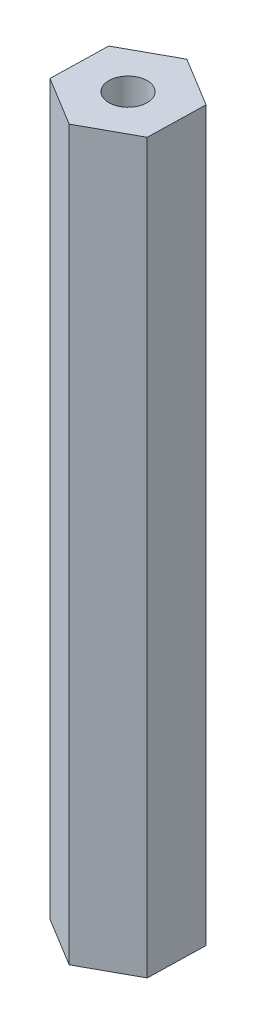
ISO-10303-21;
HEADER;
FILE_DESCRIPTION(('STEP AP214'),'2;1');
FILE_NAME('part.step','',(''),(''),'','','');
FILE_SCHEMA(('AUTOMOTIVE_DESIGN { 1 0 10303 214 1 1 1 1 }'));
ENDSEC;
DATA;
#1=APPLICATION_CONTEXT('core data for automotive mechanical design processes');
#2=APPLICATION_PROTOCOL_DEFINITION('international standard','automotive_design',2000,#1);
#3=PRODUCT_CONTEXT('',#1,'mechanical');
#4=PRODUCT('Part','Part','',(#3));
#5=PRODUCT_RELATED_PRODUCT_CATEGORY('part','',(#4));
#6=PRODUCT_DEFINITION_FORMATION('','',#4);
#7=PRODUCT_DEFINITION_CONTEXT('part definition',#1,'design');
#8=PRODUCT_DEFINITION('design','',#6,#7);
#9=PRODUCT_DEFINITION_SHAPE('','',#8);
#10=(LENGTH_UNIT() NAMED_UNIT(*) SI_UNIT(.MILLI.,.METRE.));
#11=(NAMED_UNIT(*) PLANE_ANGLE_UNIT() SI_UNIT($,.RADIAN.));
#12=(NAMED_UNIT(*) SI_UNIT($,.STERADIAN.) SOLID_ANGLE_UNIT());
#13=UNCERTAINTY_MEASURE_WITH_UNIT(LENGTH_MEASURE(1.E-05),#10,'distance_accuracy_value','');
#14=(GEOMETRIC_REPRESENTATION_CONTEXT(3) GLOBAL_UNCERTAINTY_ASSIGNED_CONTEXT((#13)) GLOBAL_UNIT_ASSIGNED_CONTEXT((#10,
#11,#12)) REPRESENTATION_CONTEXT('',''));
#15=CARTESIAN_POINT('',(0.,0.,0.));
#16=DIRECTION('',(0.,0.,1.));
#17=DIRECTION('',(1.,0.,0.));
#18=AXIS2_PLACEMENT_3D('',#15,#16,#17);
#19=CARTESIAN_POINT('',(6.41191031670347,47.5,3.90137660626155));
#20=DIRECTION('',(-0.999735132754464,0.,-0.0230144375645835));
#21=DIRECTION('',(-0.0230144375645835,0.,0.999735132754464));
#22=AXIS2_PLACEMENT_3D('',#19,#20,#21);
#23=PLANE('',#22);
#24=DIRECTION('',(0.0230144375645835,0.,-0.999735132754464));
#25=VECTOR('',#24,1.);
#26=CARTESIAN_POINT('',(6.41191031670347,-47.5,3.90137660626155));
#27=LINE('',#26,#25);
#28=CARTESIAN_POINT('',(6.41191031670347,-47.5,3.90137660626155));
#29=VERTEX_POINT('',#28);
#30=CARTESIAN_POINT('',(6.58464640910456,-47.5,-3.60218891792196));
#31=VERTEX_POINT('',#30);
#32=EDGE_CURVE('E124',#29,#31,#27,.T.);
#33=ORIENTED_EDGE('',*,*,#32,.T.);
#34=DIRECTION('',(0.,-1.,0.));
#35=VECTOR('',#34,1.);
#36=CARTESIAN_POINT('',(6.58464640910456,47.5,-3.60218891792196));
#37=LINE('',#36,#35);
#38=CARTESIAN_POINT('',(6.58464640910456,47.5,-3.60218891792196));
#39=VERTEX_POINT('',#38);
#40=EDGE_CURVE('E11',#39,#31,#37,.T.);
#41=ORIENTED_EDGE('',*,*,#40,.F.);
#42=DIRECTION('',(0.0230144375645835,0.,-0.999735132754464));
#43=VECTOR('',#42,1.);
#44=CARTESIAN_POINT('',(6.41191031670347,47.5,3.90137660626155));
#45=LINE('',#44,#43);
#46=CARTESIAN_POINT('',(6.41191031670347,47.5,3.90137660626155));
#47=VERTEX_POINT('',#46);
#48=EDGE_CURVE('E135',#47,#39,#45,.T.);
#49=ORIENTED_EDGE('',*,*,#48,.F.);
#50=DIRECTION('',(0.,-1.,0.));
#51=VECTOR('',#50,1.);
#52=CARTESIAN_POINT('',(6.41191031670347,47.5,3.90137660626155));
#53=LINE('',#52,#51);
#54=EDGE_CURVE('E120',#47,#29,#53,.T.);
#55=ORIENTED_EDGE('',*,*,#54,.T.);
#56=EDGE_LOOP('',(#33,#41,#49,#55));
#57=FACE_BOUND('',#56,.T.);
#58=ADVANCED_FACE('F39',(#57),#23,.F.);
#59=CARTESIAN_POINT('',(6.58464640910456,47.5,-3.60218891792196));
#60=DIRECTION('',(-0.519798653961973,0.,0.854288803238882));
#61=DIRECTION('',(0.854288803238882,0.,0.519798653961973));
#62=AXIS2_PLACEMENT_3D('',#59,#60,#61);
#63=PLANE('',#62);
#64=DIRECTION('',(-0.854288803238882,0.,-0.519798653961973));
#65=VECTOR('',#64,1.);
#66=CARTESIAN_POINT('',(6.58464640910456,-47.5,-3.60218891792196));
#67=LINE('',#66,#65);
#68=CARTESIAN_POINT('',(0.172736092401086,-47.5,-7.50356552418351));
#69=VERTEX_POINT('',#68);
#70=EDGE_CURVE('E127',#31,#69,#67,.T.);
#71=ORIENTED_EDGE('',*,*,#70,.T.);
#72=DIRECTION('',(0.,-1.,0.));
#73=VECTOR('',#72,1.);
#74=CARTESIAN_POINT('',(0.172736092401086,47.5,-7.50356552418351));
#75=LINE('',#74,#73);
#76=CARTESIAN_POINT('',(0.172736092401086,47.5,-7.50356552418351));
#77=VERTEX_POINT('',#76);
#78=EDGE_CURVE('E48',#77,#69,#75,.T.);
#79=ORIENTED_EDGE('',*,*,#78,.F.);
#80=DIRECTION('',(-0.854288803238882,0.,-0.519798653961973));
#81=VECTOR('',#80,1.);
#82=CARTESIAN_POINT('',(6.58464640910456,47.5,-3.60218891792196));
#83=LINE('',#82,#81);
#84=EDGE_CURVE('E93',#39,#77,#83,.T.);
#85=ORIENTED_EDGE('',*,*,#84,.F.);
#86=ORIENTED_EDGE('',*,*,#40,.T.);
#87=EDGE_LOOP('',(#71,#79,#85,#86));
#88=FACE_BOUND('',#87,.T.);
#89=ADVANCED_FACE('F161',(#88),#63,.F.);
#90=CARTESIAN_POINT('',(0.172736092401086,47.5,-7.50356552418351));
#91=DIRECTION('',(0.479936478792491,0.,0.877303240803466));
#92=DIRECTION('',(0.877303240803466,0.,-0.479936478792491));
#93=AXIS2_PLACEMENT_3D('',#90,#91,#92);
#94=PLANE('',#93);
#95=DIRECTION('',(-0.877303240803466,0.,0.479936478792491));
#96=VECTOR('',#95,1.);
#97=CARTESIAN_POINT('',(0.172736092401086,-47.5,-7.50356552418351));
#98=LINE('',#97,#96);
#99=CARTESIAN_POINT('',(-6.41191031670348,-47.5,-3.90137660626155));
#100=VERTEX_POINT('',#99);
#101=EDGE_CURVE('E130',#69,#100,#98,.T.);
#102=ORIENTED_EDGE('',*,*,#101,.T.);
#103=DIRECTION('',(0.,-1.,0.));
#104=VECTOR('',#103,1.);
#105=CARTESIAN_POINT('',(-6.41191031670348,47.5,-3.90137660626155));
#106=LINE('',#105,#104);
#107=CARTESIAN_POINT('',(-6.41191031670348,47.5,-3.90137660626155));
#108=VERTEX_POINT('',#107);
#109=EDGE_CURVE('E115',#108,#100,#106,.T.);
#110=ORIENTED_EDGE('',*,*,#109,.F.);
#111=DIRECTION('',(-0.877303240803466,0.,0.479936478792491));
#112=VECTOR('',#111,1.);
#113=CARTESIAN_POINT('',(0.172736092401086,47.5,-7.50356552418351));
#114=LINE('',#113,#112);
#115=EDGE_CURVE('E106',#77,#108,#114,.T.);
#116=ORIENTED_EDGE('',*,*,#115,.F.);
#117=ORIENTED_EDGE('',*,*,#78,.T.);
#118=EDGE_LOOP('',(#102,#110,#116,#117));
#119=FACE_BOUND('',#118,.T.);
#120=ADVANCED_FACE('F142',(#119),#94,.F.);
#121=CARTESIAN_POINT('',(-6.41191031670348,47.5,-3.90137660626155));
#122=DIRECTION('',(0.999735132754464,0.,0.0230144375645835));
#123=DIRECTION('',(0.0230144375645835,0.,-0.999735132754464));
#124=AXIS2_PLACEMENT_3D('',#121,#122,#123);
#125=PLANE('',#124);
#126=DIRECTION('',(-0.0230144375645835,0.,0.999735132754464));
#127=VECTOR('',#126,1.);
#128=CARTESIAN_POINT('',(-6.41191031670348,-47.5,-3.90137660626155));
#129=LINE('',#128,#127);
#130=CARTESIAN_POINT('',(-6.58464640910456,-47.5,3.60218891792196));
#131=VERTEX_POINT('',#130);
#132=EDGE_CURVE('E114',#100,#131,#129,.T.);
#133=ORIENTED_EDGE('',*,*,#132,.T.);
#134=DIRECTION('',(0.,-1.,0.));
#135=VECTOR('',#134,1.);
#136=CARTESIAN_POINT('',(-6.58464640910456,47.5,3.60218891792196));
#137=LINE('',#136,#135);
#138=CARTESIAN_POINT('',(-6.58464640910456,47.5,3.60218891792196));
#139=VERTEX_POINT('',#138);
#140=EDGE_CURVE('E111',#139,#131,#137,.T.);
#141=ORIENTED_EDGE('',*,*,#140,.F.);
#142=DIRECTION('',(-0.0230144375645835,0.,0.999735132754464));
#143=VECTOR('',#142,1.);
#144=CARTESIAN_POINT('',(-6.41191031670348,47.5,-3.90137660626155));
#145=LINE('',#144,#143);
#146=EDGE_CURVE('E100',#108,#139,#145,.T.);
#147=ORIENTED_EDGE('',*,*,#146,.F.);
#148=ORIENTED_EDGE('',*,*,#109,.T.);
#149=EDGE_LOOP('',(#133,#141,#147,#148));
#150=FACE_BOUND('',#149,.T.);
#151=ADVANCED_FACE('F112',(#150),#125,.F.);
#152=CARTESIAN_POINT('',(-6.58464640910456,47.5,3.60218891792196));
#153=DIRECTION('',(0.519798653961973,0.,-0.854288803238882));
#154=DIRECTION('',(-0.854288803238882,0.,-0.519798653961973));
#155=AXIS2_PLACEMENT_3D('',#152,#153,#154);
#156=PLANE('',#155);
#157=DIRECTION('',(0.854288803238882,0.,0.519798653961972));
#158=VECTOR('',#157,1.);
#159=CARTESIAN_POINT('',(-6.58464640910456,-47.5,3.60218891792196));
#160=LINE('',#159,#158);
#161=CARTESIAN_POINT('',(-0.172736092401083,-47.5,7.50356552418351));
#162=VERTEX_POINT('',#161);
#163=EDGE_CURVE('E79',#131,#162,#160,.T.);
#164=ORIENTED_EDGE('',*,*,#163,.T.);
#165=DIRECTION('',(0.,-1.,0.));
#166=VECTOR('',#165,1.);
#167=CARTESIAN_POINT('',(-0.172736092401083,47.5,7.50356552418351));
#168=LINE('',#167,#166);
#169=CARTESIAN_POINT('',(-0.172736092401083,47.5,7.50356552418351));
#170=VERTEX_POINT('',#169);
#171=EDGE_CURVE('E116',#170,#162,#168,.T.);
#172=ORIENTED_EDGE('',*,*,#171,.F.);
#173=DIRECTION('',(0.854288803238882,0.,0.519798653961972));
#174=VECTOR('',#173,1.);
#175=CARTESIAN_POINT('',(-6.58464640910456,47.5,3.60218891792196));
#176=LINE('',#175,#174);
#177=EDGE_CURVE('E104',#139,#170,#176,.T.);
#178=ORIENTED_EDGE('',*,*,#177,.F.);
#179=ORIENTED_EDGE('',*,*,#140,.T.);
#180=EDGE_LOOP('',(#164,#172,#178,#179));
#181=FACE_BOUND('',#180,.T.);
#182=ADVANCED_FACE('F118',(#181),#156,.F.);
#183=CARTESIAN_POINT('',(-0.172736092401083,47.5,7.50356552418351));
#184=DIRECTION('',(-0.479936478792492,0.,-0.877303240803466));
#185=DIRECTION('',(-0.877303240803466,0.,0.479936478792492));
#186=AXIS2_PLACEMENT_3D('',#183,#184,#185);
#187=PLANE('',#186);
#188=DIRECTION('',(0.877303240803466,0.,-0.479936478792492));
#189=VECTOR('',#188,1.);
#190=CARTESIAN_POINT('',(-0.172736092401083,-47.5,7.50356552418351));
#191=LINE('',#190,#189);
#192=EDGE_CURVE('E85',#162,#29,#191,.T.);
#193=ORIENTED_EDGE('',*,*,#192,.T.);
#194=ORIENTED_EDGE('',*,*,#54,.F.);
#195=DIRECTION('',(0.877303240803466,0.,-0.479936478792492));
#196=VECTOR('',#195,1.);
#197=CARTESIAN_POINT('',(-0.172736092401083,47.5,7.50356552418351));
#198=LINE('',#197,#196);
#199=EDGE_CURVE('E56',#170,#47,#198,.T.);
#200=ORIENTED_EDGE('',*,*,#199,.F.);
#201=ORIENTED_EDGE('',*,*,#171,.T.);
#202=EDGE_LOOP('',(#193,#194,#200,#201));
#203=FACE_BOUND('',#202,.T.);
#204=ADVANCED_FACE('F149',(#203),#187,.F.);
#205=CARTESIAN_POINT('',(0.,47.5,0.));
#206=DIRECTION('',(0.,1.,0.));
#207=DIRECTION('',(0.,0.,1.));
#208=AXIS2_PLACEMENT_3D('',#205,#206,#207);
#209=PLANE('',#208);
#210=CARTESIAN_POINT('',(0.,47.5,0.));
#211=DIRECTION('',(0.,1.,0.));
#212=DIRECTION('',(0.,0.,1.));
#213=AXIS2_PLACEMENT_3D('',#210,#211,#212);
#214=CIRCLE('',#213,2.5);
#215=CARTESIAN_POINT('',(0.,47.5,2.5));
#216=VERTEX_POINT('',#215);
#217=EDGE_CURVE('E128',#216,#216,#214,.T.);
#218=ORIENTED_EDGE('',*,*,#217,.F.);
#219=EDGE_LOOP('',(#218));
#220=FACE_BOUND('',#219,.T.);
#221=ORIENTED_EDGE('',*,*,#48,.T.);
#222=ORIENTED_EDGE('',*,*,#84,.T.);
#223=ORIENTED_EDGE('',*,*,#115,.T.);
#224=ORIENTED_EDGE('',*,*,#146,.T.);
#225=ORIENTED_EDGE('',*,*,#177,.T.);
#226=ORIENTED_EDGE('',*,*,#199,.T.);
#227=EDGE_LOOP('',(#221,#222,#223,#224,#225,#226));
#228=FACE_BOUND('',#227,.T.);
#229=ADVANCED_FACE('F102',(#220,#228),#209,.T.);
#230=CARTESIAN_POINT('',(0.,-47.5,0.));
#231=DIRECTION('',(0.,1.,0.));
#232=DIRECTION('',(0.,0.,1.));
#233=AXIS2_PLACEMENT_3D('',#230,#231,#232);
#234=PLANE('',#233);
#235=CARTESIAN_POINT('',(0.,-47.5,0.));
#236=DIRECTION('',(0.,1.,0.));
#237=DIRECTION('',(0.,0.,1.));
#238=AXIS2_PLACEMENT_3D('',#235,#236,#237);
#239=CIRCLE('',#238,2.5);
#240=CARTESIAN_POINT('',(0.,-47.5,2.5));
#241=VERTEX_POINT('',#240);
#242=EDGE_CURVE('E42',#241,#241,#239,.T.);
#243=ORIENTED_EDGE('',*,*,#242,.T.);
#244=EDGE_LOOP('',(#243));
#245=FACE_BOUND('',#244,.T.);
#246=ORIENTED_EDGE('',*,*,#32,.F.);
#247=ORIENTED_EDGE('',*,*,#192,.F.);
#248=ORIENTED_EDGE('',*,*,#163,.F.);
#249=ORIENTED_EDGE('',*,*,#132,.F.);
#250=ORIENTED_EDGE('',*,*,#101,.F.);
#251=ORIENTED_EDGE('',*,*,#70,.F.);
#252=EDGE_LOOP('',(#246,#247,#248,#249,#250,#251));
#253=FACE_BOUND('',#252,.T.);
#254=ADVANCED_FACE('F145',(#245,#253),#234,.F.);
#255=CARTESIAN_POINT('',(0.,-52.,0.));
#256=DIRECTION('',(0.,1.,0.));
#257=DIRECTION('',(0.,0.,1.));
#258=AXIS2_PLACEMENT_3D('',#255,#256,#257);
#259=CYLINDRICAL_SURFACE('',#258,2.5);
#260=ORIENTED_EDGE('',*,*,#217,.T.);
#261=EDGE_LOOP('',(#260));
#262=FACE_BOUND('',#261,.T.);
#263=ORIENTED_EDGE('',*,*,#242,.F.);
#264=EDGE_LOOP('',(#263));
#265=FACE_BOUND('',#264,.T.);
#266=ADVANCED_FACE('F198',(#262,#265),#259,.F.);
#267=CLOSED_SHELL('',(#58,#89,#120,#151,#182,#204,#229,#254,#266));
#268=MANIFOLD_SOLID_BREP('B2',#267);
#269=ADVANCED_BREP_SHAPE_REPRESENTATION('',(#18,#268),#14);
#270=SHAPE_DEFINITION_REPRESENTATION(#9,#269);
ENDSEC;
END-ISO-10303-21;
